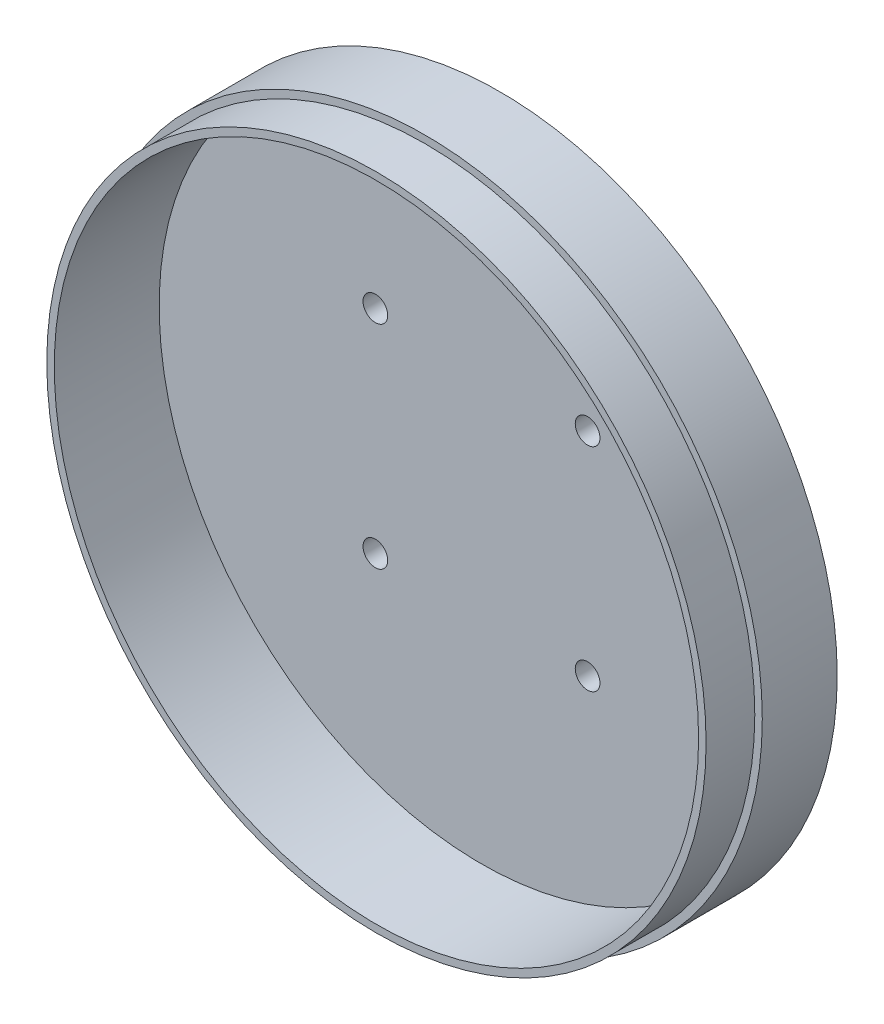
ISO-10303-21;
HEADER;
FILE_DESCRIPTION(('STEP AP214'),'2;1');
FILE_NAME('part.step','',(''),(''),'','','');
FILE_SCHEMA(('AUTOMOTIVE_DESIGN { 1 0 10303 214 1 1 1 1 }'));
ENDSEC;
DATA;
#1=APPLICATION_CONTEXT('core data for automotive mechanical design processes');
#2=APPLICATION_PROTOCOL_DEFINITION('international standard','automotive_design',2000,#1);
#3=PRODUCT_CONTEXT('',#1,'mechanical');
#4=PRODUCT('Part','Part','',(#3));
#5=PRODUCT_RELATED_PRODUCT_CATEGORY('part','',(#4));
#6=PRODUCT_DEFINITION_FORMATION('','',#4);
#7=PRODUCT_DEFINITION_CONTEXT('part definition',#1,'design');
#8=PRODUCT_DEFINITION('design','',#6,#7);
#9=PRODUCT_DEFINITION_SHAPE('','',#8);
#10=(LENGTH_UNIT() NAMED_UNIT(*) SI_UNIT(.MILLI.,.METRE.));
#11=(NAMED_UNIT(*) PLANE_ANGLE_UNIT() SI_UNIT($,.RADIAN.));
#12=(NAMED_UNIT(*) SI_UNIT($,.STERADIAN.) SOLID_ANGLE_UNIT());
#13=UNCERTAINTY_MEASURE_WITH_UNIT(LENGTH_MEASURE(1.E-05),#10,'distance_accuracy_value','');
#14=(GEOMETRIC_REPRESENTATION_CONTEXT(3) GLOBAL_UNCERTAINTY_ASSIGNED_CONTEXT((#13)) GLOBAL_UNIT_ASSIGNED_CONTEXT((#10,
#11,#12)) REPRESENTATION_CONTEXT('',''));
#15=CARTESIAN_POINT('',(0.,0.,0.));
#16=DIRECTION('',(0.,0.,1.));
#17=DIRECTION('',(1.,0.,0.));
#18=AXIS2_PLACEMENT_3D('',#15,#16,#17);
#19=CARTESIAN_POINT('',(0.,0.,14.));
#20=DIRECTION('',(0.,0.,-1.));
#21=DIRECTION('',(-1.,0.,0.));
#22=AXIS2_PLACEMENT_3D('',#19,#20,#21);
#23=CYLINDRICAL_SURFACE('',#22,44.);
#24=CARTESIAN_POINT('',(0.,0.,14.));
#25=DIRECTION('',(0.,0.,1.));
#26=DIRECTION('',(1.,0.,0.));
#27=AXIS2_PLACEMENT_3D('',#24,#25,#26);
#28=CIRCLE('',#27,44.);
#29=CARTESIAN_POINT('',(44.,0.,14.));
#30=VERTEX_POINT('',#29);
#31=EDGE_CURVE('E52',#30,#30,#28,.T.);
#32=ORIENTED_EDGE('',*,*,#31,.F.);
#33=EDGE_LOOP('',(#32));
#34=FACE_BOUND('',#33,.T.);
#35=CARTESIAN_POINT('',(0.,0.,7.5));
#36=DIRECTION('',(0.,0.,-1.));
#37=DIRECTION('',(-1.,0.,0.));
#38=AXIS2_PLACEMENT_3D('',#35,#36,#37);
#39=CIRCLE('',#38,44.);
#40=CARTESIAN_POINT('',(-44.,0.,7.5));
#41=VERTEX_POINT('',#40);
#42=EDGE_CURVE('E10',#41,#41,#39,.T.);
#43=ORIENTED_EDGE('',*,*,#42,.F.);
#44=EDGE_LOOP('',(#43));
#45=FACE_BOUND('',#44,.T.);
#46=ADVANCED_FACE('F45',(#34,#45),#23,.T.);
#47=CARTESIAN_POINT('',(0.,0.,14.));
#48=DIRECTION('',(0.,0.,1.));
#49=DIRECTION('',(1.,0.,0.));
#50=AXIS2_PLACEMENT_3D('',#47,#48,#49);
#51=PLANE('',#50);
#52=ORIENTED_EDGE('',*,*,#31,.T.);
#53=EDGE_LOOP('',(#52));
#54=FACE_BOUND('',#53,.T.);
#55=CARTESIAN_POINT('',(0.,0.,14.));
#56=DIRECTION('',(0.,0.,1.));
#57=DIRECTION('',(1.,0.,0.));
#58=AXIS2_PLACEMENT_3D('',#55,#56,#57);
#59=CIRCLE('',#58,43.);
#60=CARTESIAN_POINT('',(43.,0.,14.));
#61=VERTEX_POINT('',#60);
#62=EDGE_CURVE('E57',#61,#61,#59,.T.);
#63=ORIENTED_EDGE('',*,*,#62,.F.);
#64=EDGE_LOOP('',(#63));
#65=FACE_BOUND('',#64,.T.);
#66=ADVANCED_FACE('F139',(#54,#65),#51,.T.);
#67=CARTESIAN_POINT('',(0.,0.,14.));
#68=DIRECTION('',(0.,0.,-1.));
#69=DIRECTION('',(-1.,0.,0.));
#70=AXIS2_PLACEMENT_3D('',#67,#68,#69);
#71=CYLINDRICAL_SURFACE('',#70,43.);
#72=ORIENTED_EDGE('',*,*,#62,.T.);
#73=EDGE_LOOP('',(#72));
#74=FACE_BOUND('',#73,.T.);
#75=CARTESIAN_POINT('',(0.,0.,0.));
#76=DIRECTION('',(0.,0.,1.));
#77=DIRECTION('',(1.,0.,0.));
#78=AXIS2_PLACEMENT_3D('',#75,#76,#77);
#79=CIRCLE('',#78,43.);
#80=CARTESIAN_POINT('',(43.,0.,0.));
#81=VERTEX_POINT('',#80);
#82=EDGE_CURVE('E62',#81,#81,#79,.T.);
#83=ORIENTED_EDGE('',*,*,#82,.F.);
#84=EDGE_LOOP('',(#83));
#85=FACE_BOUND('',#84,.T.);
#86=ADVANCED_FACE('F146',(#74,#85),#71,.F.);
#87=CARTESIAN_POINT('',(0.,0.,7.5));
#88=DIRECTION('',(0.,0.,-1.));
#89=DIRECTION('',(-1.,0.,0.));
#90=AXIS2_PLACEMENT_3D('',#87,#88,#89);
#91=CYLINDRICAL_SURFACE('',#90,45.);
#92=CARTESIAN_POINT('',(0.,0.,7.5));
#93=DIRECTION('',(0.,0.,-1.));
#94=DIRECTION('',(-1.,0.,0.));
#95=AXIS2_PLACEMENT_3D('',#92,#93,#94);
#96=CIRCLE('',#95,45.);
#97=CARTESIAN_POINT('',(-45.,0.,7.5));
#98=VERTEX_POINT('',#97);
#99=EDGE_CURVE('E67',#98,#98,#96,.T.);
#100=ORIENTED_EDGE('',*,*,#99,.T.);
#101=EDGE_LOOP('',(#100));
#102=FACE_BOUND('',#101,.T.);
#103=CARTESIAN_POINT('',(0.,0.,-2.5));
#104=DIRECTION('',(0.,0.,-1.));
#105=DIRECTION('',(-1.,0.,0.));
#106=AXIS2_PLACEMENT_3D('',#103,#104,#105);
#107=CIRCLE('',#106,45.);
#108=CARTESIAN_POINT('',(-45.,0.,-2.5));
#109=VERTEX_POINT('',#108);
#110=EDGE_CURVE('E69',#109,#109,#107,.T.);
#111=ORIENTED_EDGE('',*,*,#110,.F.);
#112=EDGE_LOOP('',(#111));
#113=FACE_BOUND('',#112,.T.);
#114=ADVANCED_FACE('F151',(#102,#113),#91,.T.);
#115=CARTESIAN_POINT('',(0.,0.,7.5));
#116=DIRECTION('',(0.,0.,-1.));
#117=DIRECTION('',(-1.,0.,0.));
#118=AXIS2_PLACEMENT_3D('',#115,#116,#117);
#119=PLANE('',#118);
#120=ORIENTED_EDGE('',*,*,#42,.T.);
#121=EDGE_LOOP('',(#120));
#122=FACE_BOUND('',#121,.T.);
#123=ORIENTED_EDGE('',*,*,#99,.F.);
#124=EDGE_LOOP('',(#123));
#125=FACE_BOUND('',#124,.T.);
#126=ADVANCED_FACE('F115',(#122,#125),#119,.F.);
#127=CARTESIAN_POINT('',(0.,0.,-2.5));
#128=DIRECTION('',(0.,0.,-1.));
#129=DIRECTION('',(-1.,0.,0.));
#130=AXIS2_PLACEMENT_3D('',#127,#128,#129);
#131=PLANE('',#130);
#132=ORIENTED_EDGE('',*,*,#110,.T.);
#133=EDGE_LOOP('',(#132));
#134=FACE_BOUND('',#133,.T.);
#135=CARTESIAN_POINT('',(-14.1421356237311,-14.1819663921907,-2.5));
#136=DIRECTION('',(0.,0.,-1.));
#137=DIRECTION('',(-1.,0.,0.));
#138=AXIS2_PLACEMENT_3D('',#135,#136,#137);
#139=CIRCLE('',#138,1.65);
#140=CARTESIAN_POINT('',(-15.7921356237311,-14.1819663921907,-2.5));
#141=VERTEX_POINT('',#140);
#142=EDGE_CURVE('E104',#141,#141,#139,.T.);
#143=ORIENTED_EDGE('',*,*,#142,.F.);
#144=EDGE_LOOP('',(#143));
#145=FACE_BOUND('',#144,.T.);
#146=CARTESIAN_POINT('',(14.1819663921908,-14.1819663921909,-2.5));
#147=DIRECTION('',(0.,0.,-1.));
#148=DIRECTION('',(-1.,0.,0.));
#149=AXIS2_PLACEMENT_3D('',#146,#147,#148);
#150=CIRCLE('',#149,1.65);
#151=CARTESIAN_POINT('',(12.5319663921908,-14.1819663921909,-2.5));
#152=VERTEX_POINT('',#151);
#153=EDGE_CURVE('E96',#152,#152,#150,.T.);
#154=ORIENTED_EDGE('',*,*,#153,.F.);
#155=EDGE_LOOP('',(#154));
#156=FACE_BOUND('',#155,.T.);
#157=CARTESIAN_POINT('',(14.1819663921909,14.1421356237309,-2.5));
#158=DIRECTION('',(0.,0.,-1.));
#159=DIRECTION('',(-1.,0.,0.));
#160=AXIS2_PLACEMENT_3D('',#157,#158,#159);
#161=CIRCLE('',#160,1.65);
#162=CARTESIAN_POINT('',(12.5319663921909,14.1421356237309,-2.5));
#163=VERTEX_POINT('',#162);
#164=EDGE_CURVE('E88',#163,#163,#161,.T.);
#165=ORIENTED_EDGE('',*,*,#164,.F.);
#166=EDGE_LOOP('',(#165));
#167=FACE_BOUND('',#166,.T.);
#168=CARTESIAN_POINT('',(-14.1421356237309,14.142135623731,-2.5));
#169=DIRECTION('',(0.,0.,-1.));
#170=DIRECTION('',(-1.,0.,0.));
#171=AXIS2_PLACEMENT_3D('',#168,#169,#170);
#172=CIRCLE('',#171,1.65);
#173=CARTESIAN_POINT('',(-15.7921356237309,14.142135623731,-2.5));
#174=VERTEX_POINT('',#173);
#175=EDGE_CURVE('E80',#174,#174,#172,.T.);
#176=ORIENTED_EDGE('',*,*,#175,.F.);
#177=EDGE_LOOP('',(#176));
#178=FACE_BOUND('',#177,.T.);
#179=ADVANCED_FACE('F111',(#134,#145,#156,#167,#178),#131,.T.);
#180=CARTESIAN_POINT('',(0.,0.,0.));
#181=DIRECTION('',(0.,0.,1.));
#182=DIRECTION('',(1.,0.,0.));
#183=AXIS2_PLACEMENT_3D('',#180,#181,#182);
#184=PLANE('',#183);
#185=ORIENTED_EDGE('',*,*,#82,.T.);
#186=EDGE_LOOP('',(#185));
#187=FACE_BOUND('',#186,.T.);
#188=CARTESIAN_POINT('',(-14.1421356237311,-14.1819663921907,0.));
#189=DIRECTION('',(0.,0.,-1.));
#190=DIRECTION('',(-1.,0.,0.));
#191=AXIS2_PLACEMENT_3D('',#188,#189,#190);
#192=CIRCLE('',#191,1.65);
#193=CARTESIAN_POINT('',(-15.7921356237311,-14.1819663921907,0.));
#194=VERTEX_POINT('',#193);
#195=EDGE_CURVE('E100',#194,#194,#192,.T.);
#196=ORIENTED_EDGE('',*,*,#195,.T.);
#197=EDGE_LOOP('',(#196));
#198=FACE_BOUND('',#197,.T.);
#199=CARTESIAN_POINT('',(-14.1421356237309,14.142135623731,0.));
#200=DIRECTION('',(0.,0.,1.));
#201=DIRECTION('',(1.,0.,0.));
#202=AXIS2_PLACEMENT_3D('',#199,#200,#201);
#203=CIRCLE('',#202,1.65);
#204=CARTESIAN_POINT('',(-12.4921356237309,14.142135623731,0.));
#205=VERTEX_POINT('',#204);
#206=EDGE_CURVE('E73',#205,#205,#203,.T.);
#207=ORIENTED_EDGE('',*,*,#206,.F.);
#208=EDGE_LOOP('',(#207));
#209=FACE_BOUND('',#208,.T.);
#210=CARTESIAN_POINT('',(14.1819663921909,14.1421356237309,0.));
#211=DIRECTION('',(0.,0.,-1.));
#212=DIRECTION('',(-1.,0.,0.));
#213=AXIS2_PLACEMENT_3D('',#210,#211,#212);
#214=CIRCLE('',#213,1.65);
#215=CARTESIAN_POINT('',(12.5319663921909,14.1421356237309,0.));
#216=VERTEX_POINT('',#215);
#217=EDGE_CURVE('E84',#216,#216,#214,.T.);
#218=ORIENTED_EDGE('',*,*,#217,.T.);
#219=EDGE_LOOP('',(#218));
#220=FACE_BOUND('',#219,.T.);
#221=CARTESIAN_POINT('',(14.1819663921908,-14.1819663921909,0.));
#222=DIRECTION('',(0.,0.,-1.));
#223=DIRECTION('',(-1.,0.,0.));
#224=AXIS2_PLACEMENT_3D('',#221,#222,#223);
#225=CIRCLE('',#224,1.65);
#226=CARTESIAN_POINT('',(12.5319663921908,-14.1819663921909,0.));
#227=VERTEX_POINT('',#226);
#228=EDGE_CURVE('E92',#227,#227,#225,.T.);
#229=ORIENTED_EDGE('',*,*,#228,.T.);
#230=EDGE_LOOP('',(#229));
#231=FACE_BOUND('',#230,.T.);
#232=ADVANCED_FACE('F114',(#187,#198,#209,#220,#231),#184,.T.);
#233=CARTESIAN_POINT('',(-14.1421356237309,14.142135623731,-2.5));
#234=DIRECTION('',(0.,0.,-1.));
#235=DIRECTION('',(-1.,0.,0.));
#236=AXIS2_PLACEMENT_3D('',#233,#234,#235);
#237=CYLINDRICAL_SURFACE('',#236,1.65);
#238=ORIENTED_EDGE('',*,*,#206,.T.);
#239=EDGE_LOOP('',(#238));
#240=FACE_BOUND('',#239,.T.);
#241=ORIENTED_EDGE('',*,*,#175,.T.);
#242=EDGE_LOOP('',(#241));
#243=FACE_BOUND('',#242,.T.);
#244=ADVANCED_FACE('F124',(#240,#243),#237,.F.);
#245=CARTESIAN_POINT('',(14.1819663921909,14.1421356237309,-2.5));
#246=DIRECTION('',(0.,0.,-1.));
#247=DIRECTION('',(-1.,0.,0.));
#248=AXIS2_PLACEMENT_3D('',#245,#246,#247);
#249=CYLINDRICAL_SURFACE('',#248,1.65);
#250=ORIENTED_EDGE('',*,*,#217,.F.);
#251=EDGE_LOOP('',(#250));
#252=FACE_BOUND('',#251,.T.);
#253=ORIENTED_EDGE('',*,*,#164,.T.);
#254=EDGE_LOOP('',(#253));
#255=FACE_BOUND('',#254,.T.);
#256=ADVANCED_FACE('F126',(#252,#255),#249,.F.);
#257=CARTESIAN_POINT('',(14.1819663921908,-14.1819663921909,-2.5));
#258=DIRECTION('',(0.,0.,-1.));
#259=DIRECTION('',(-1.,0.,0.));
#260=AXIS2_PLACEMENT_3D('',#257,#258,#259);
#261=CYLINDRICAL_SURFACE('',#260,1.65);
#262=ORIENTED_EDGE('',*,*,#228,.F.);
#263=EDGE_LOOP('',(#262));
#264=FACE_BOUND('',#263,.T.);
#265=ORIENTED_EDGE('',*,*,#153,.T.);
#266=EDGE_LOOP('',(#265));
#267=FACE_BOUND('',#266,.T.);
#268=ADVANCED_FACE('F132',(#264,#267),#261,.F.);
#269=CARTESIAN_POINT('',(-14.1421356237311,-14.1819663921907,-2.5));
#270=DIRECTION('',(0.,0.,-1.));
#271=DIRECTION('',(-1.,0.,0.));
#272=AXIS2_PLACEMENT_3D('',#269,#270,#271);
#273=CYLINDRICAL_SURFACE('',#272,1.65);
#274=ORIENTED_EDGE('',*,*,#195,.F.);
#275=EDGE_LOOP('',(#274));
#276=FACE_BOUND('',#275,.T.);
#277=ORIENTED_EDGE('',*,*,#142,.T.);
#278=EDGE_LOOP('',(#277));
#279=FACE_BOUND('',#278,.T.);
#280=ADVANCED_FACE('F109',(#276,#279),#273,.F.);
#281=CLOSED_SHELL('',(#46,#66,#86,#114,#126,#179,#232,#244,#256,#268,#280));
#282=MANIFOLD_SOLID_BREP('B2',#281);
#283=ADVANCED_BREP_SHAPE_REPRESENTATION('',(#18,#282),#14);
#284=SHAPE_DEFINITION_REPRESENTATION(#9,#283);
ENDSEC;
END-ISO-10303-21;
